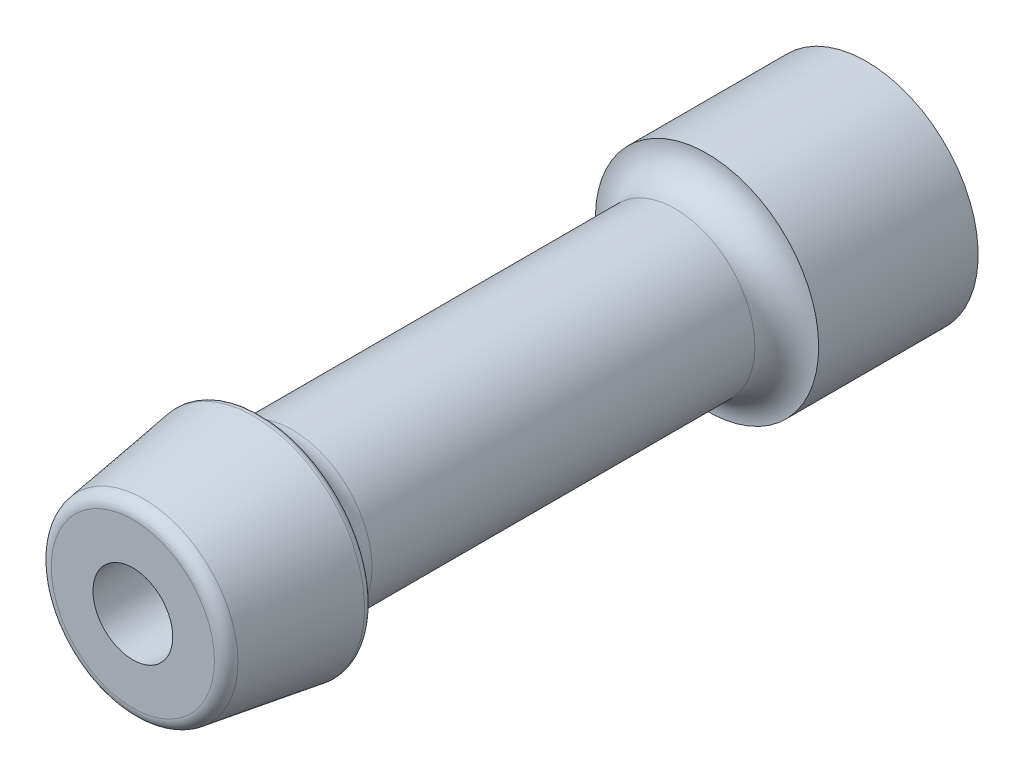
ISO-10303-21;
HEADER;
FILE_DESCRIPTION(('STEP AP214'),'2;1');
FILE_NAME('part.step','',(''),(''),'','','');
FILE_SCHEMA(('AUTOMOTIVE_DESIGN { 1 0 10303 214 1 1 1 1 }'));
ENDSEC;
DATA;
#1=APPLICATION_CONTEXT('core data for automotive mechanical design processes');
#2=APPLICATION_PROTOCOL_DEFINITION('international standard','automotive_design',2000,#1);
#3=PRODUCT_CONTEXT('',#1,'mechanical');
#4=PRODUCT('Part','Part','',(#3));
#5=PRODUCT_RELATED_PRODUCT_CATEGORY('part','',(#4));
#6=PRODUCT_DEFINITION_FORMATION('','',#4);
#7=PRODUCT_DEFINITION_CONTEXT('part definition',#1,'design');
#8=PRODUCT_DEFINITION('design','',#6,#7);
#9=PRODUCT_DEFINITION_SHAPE('','',#8);
#10=(LENGTH_UNIT() NAMED_UNIT(*) SI_UNIT(.MILLI.,.METRE.));
#11=(NAMED_UNIT(*) PLANE_ANGLE_UNIT() SI_UNIT($,.RADIAN.));
#12=(NAMED_UNIT(*) SI_UNIT($,.STERADIAN.) SOLID_ANGLE_UNIT());
#13=UNCERTAINTY_MEASURE_WITH_UNIT(LENGTH_MEASURE(1.E-05),#10,'distance_accuracy_value','');
#14=(GEOMETRIC_REPRESENTATION_CONTEXT(3) GLOBAL_UNCERTAINTY_ASSIGNED_CONTEXT((#13)) GLOBAL_UNIT_ASSIGNED_CONTEXT((#10,
#11,#12)) REPRESENTATION_CONTEXT('',''));
#15=CARTESIAN_POINT('',(0.,0.,0.));
#16=DIRECTION('',(0.,0.,1.));
#17=DIRECTION('',(1.,0.,0.));
#18=AXIS2_PLACEMENT_3D('',#15,#16,#17);
#19=CARTESIAN_POINT('',(0.,0.,29.21));
#20=DIRECTION('',(0.,0.,-1.));
#21=DIRECTION('',(-1.,0.,0.));
#22=AXIS2_PLACEMENT_3D('',#19,#20,#21);
#23=CYLINDRICAL_SURFACE('',#22,4.445);
#24=CARTESIAN_POINT('',(0.,0.,0.));
#25=DIRECTION('',(0.,0.,1.));
#26=DIRECTION('',(1.,0.,0.));
#27=AXIS2_PLACEMENT_3D('',#24,#25,#26);
#28=CIRCLE('',#27,4.445);
#29=CARTESIAN_POINT('',(-4.445,0.,0.));
#30=VERTEX_POINT('',#29);
#31=EDGE_CURVE('E62',#30,#30,#28,.T.);
#32=CARTESIAN_POINT('',(0.,0.,6.35));
#33=DIRECTION('',(0.,0.,1.));
#34=DIRECTION('',(1.,0.,0.));
#35=AXIS2_PLACEMENT_3D('',#32,#33,#34);
#36=CIRCLE('',#35,4.445);
#37=CARTESIAN_POINT('',(-4.445,0.,6.34999999999999));
#38=VERTEX_POINT('',#37);
#39=EDGE_CURVE('E63',#38,#38,#36,.T.);
#40=CARTESIAN_POINT('',(-4.445,0.,0.));
#41=CARTESIAN_POINT('',(-4.445,0.,0.066145833333333));
#42=CARTESIAN_POINT('',(-4.445,0.,0.132291666666666));
#43=CARTESIAN_POINT('',(-4.445,0.,0.264583333333332));
#44=CARTESIAN_POINT('',(-4.445,0.,0.330729166666665));
#45=CARTESIAN_POINT('',(-4.445,0.,0.463020833333332));
#46=CARTESIAN_POINT('',(-4.445,0.,0.529166666666666));
#47=CARTESIAN_POINT('',(-4.445,0.,0.661458333333333));
#48=CARTESIAN_POINT('',(-4.445,0.,0.727604166666666));
#49=CARTESIAN_POINT('',(-4.445,0.,0.859895833333332));
#50=CARTESIAN_POINT('',(-4.445,0.,0.926041666666665));
#51=CARTESIAN_POINT('',(-4.445,0.,1.05833333333333));
#52=CARTESIAN_POINT('',(-4.445,0.,1.12447916666667));
#53=CARTESIAN_POINT('',(-4.445,0.,1.25677083333333));
#54=CARTESIAN_POINT('',(-4.445,0.,1.32291666666667));
#55=CARTESIAN_POINT('',(-4.445,0.,1.45520833333333));
#56=CARTESIAN_POINT('',(-4.445,0.,1.52135416666667));
#57=CARTESIAN_POINT('',(-4.445,0.,1.65364583333333));
#58=CARTESIAN_POINT('',(-4.445,0.,1.71979166666666));
#59=CARTESIAN_POINT('',(-4.445,0.,1.85208333333333));
#60=CARTESIAN_POINT('',(-4.445,0.,1.91822916666666));
#61=CARTESIAN_POINT('',(-4.445,0.,2.05052083333333));
#62=CARTESIAN_POINT('',(-4.445,0.,2.11666666666666));
#63=CARTESIAN_POINT('',(-4.445,0.,2.24895833333333));
#64=CARTESIAN_POINT('',(-4.445,0.,2.31510416666667));
#65=CARTESIAN_POINT('',(-4.445,0.,2.44739583333333));
#66=CARTESIAN_POINT('',(-4.445,0.,2.51354166666666));
#67=CARTESIAN_POINT('',(-4.445,0.,2.64583333333333));
#68=CARTESIAN_POINT('',(-4.445,0.,2.71197916666667));
#69=CARTESIAN_POINT('',(-4.445,0.,2.84427083333333));
#70=CARTESIAN_POINT('',(-4.445,0.,2.91041666666667));
#71=CARTESIAN_POINT('',(-4.445,0.,3.04270833333333));
#72=CARTESIAN_POINT('',(-4.445,0.,3.10885416666666));
#73=CARTESIAN_POINT('',(-4.445,0.,3.24114583333333));
#74=CARTESIAN_POINT('',(-4.445,0.,3.30729166666666));
#75=CARTESIAN_POINT('',(-4.445,0.,3.43958333333333));
#76=CARTESIAN_POINT('',(-4.445,0.,3.50572916666666));
#77=CARTESIAN_POINT('',(-4.445,0.,3.63802083333333));
#78=CARTESIAN_POINT('',(-4.445,0.,3.70416666666666));
#79=CARTESIAN_POINT('',(-4.445,0.,3.83645833333333));
#80=CARTESIAN_POINT('',(-4.445,0.,3.90260416666666));
#81=CARTESIAN_POINT('',(-4.445,0.,4.03489583333333));
#82=CARTESIAN_POINT('',(-4.445,0.,4.10104166666666));
#83=CARTESIAN_POINT('',(-4.445,0.,4.23333333333333));
#84=CARTESIAN_POINT('',(-4.445,0.,4.29947916666666));
#85=CARTESIAN_POINT('',(-4.445,0.,4.43177083333333));
#86=CARTESIAN_POINT('',(-4.445,0.,4.49791666666666));
#87=CARTESIAN_POINT('',(-4.445,0.,4.63020833333333));
#88=CARTESIAN_POINT('',(-4.445,0.,4.69635416666666));
#89=CARTESIAN_POINT('',(-4.445,0.,4.82864583333333));
#90=CARTESIAN_POINT('',(-4.445,0.,4.89479166666666));
#91=CARTESIAN_POINT('',(-4.445,0.,5.02708333333333));
#92=CARTESIAN_POINT('',(-4.445,0.,5.09322916666666));
#93=CARTESIAN_POINT('',(-4.445,0.,5.22552083333333));
#94=CARTESIAN_POINT('',(-4.445,0.,5.29166666666666));
#95=CARTESIAN_POINT('',(-4.445,0.,5.42395833333333));
#96=CARTESIAN_POINT('',(-4.445,0.,5.49010416666666));
#97=CARTESIAN_POINT('',(-4.445,0.,5.62239583333333));
#98=CARTESIAN_POINT('',(-4.445,0.,5.68854166666666));
#99=CARTESIAN_POINT('',(-4.445,0.,5.82083333333333));
#100=CARTESIAN_POINT('',(-4.445,0.,5.88697916666666));
#101=CARTESIAN_POINT('',(-4.445,0.,6.01927083333333));
#102=CARTESIAN_POINT('',(-4.445,0.,6.08541666666666));
#103=CARTESIAN_POINT('',(-4.445,0.,6.21770833333333));
#104=CARTESIAN_POINT('',(-4.445,0.,6.28385416666666));
#105=CARTESIAN_POINT('',(-4.445,0.,6.34999999999999));
#106=B_SPLINE_CURVE_WITH_KNOTS('',3,(#40,#41,#42,#43,#44,#45,#46,#47,#48,#49,#50,#51,#52,#53,
#54,#55,#56,#57,#58,#59,#60,#61,#62,#63,#64,#65,#66,#67,#68,#69,#70,#71,#72,#73,#74,#75,#76,#77,
#78,#79,#80,#81,#82,#83,#84,#85,#86,#87,#88,#89,#90,#91,#92,#93,#94,#95,#96,#97,#98,#99,#100,
#101,#102,#103,#104,#105),.UNSPECIFIED.,.F.,.F.,(4,2,2,2,2,2,2,2,2,2,2,2,2,2,2,2,2,2,2,2,2,2,2,
2,2,2,2,2,2,2,2,2,4),(0.,0.198437499999999,0.396874999999998,0.5953125,0.793749999999999,
0.992187499999998,1.190625,1.3890625,1.5875,1.7859375,1.984375,2.1828125,2.38125,2.5796875,
2.778125,2.9765625,3.175,3.3734375,3.571875,3.7703125,3.96875,4.1671875,4.365625,4.5640625,
4.7625,4.96093749999999,5.15937499999999,5.3578125,5.55625,5.75468749999999,5.953125,6.1515625,
6.34999999999999),.UNSPECIFIED.);
#107=EDGE_CURVE('BSEAM36',#30,#38,#106,.T.);
#108=ORIENTED_EDGE('',*,*,#31,.T.);
#109=ORIENTED_EDGE('',*,*,#39,.F.);
#110=ORIENTED_EDGE('',*,*,#107,.T.);
#111=ORIENTED_EDGE('',*,*,#107,.F.);
#112=EDGE_LOOP('',(#108,#110,#109,#111));
#113=FACE_BOUND('',#112,.T.);
#114=ADVANCED_FACE('F36',(#113),#23,.T.);
#115=CARTESIAN_POINT('',(0.,0.,29.21));
#116=DIRECTION('',(0.,0.,1.));
#117=DIRECTION('',(1.,0.,0.));
#118=AXIS2_PLACEMENT_3D('',#115,#116,#117);
#119=PLANE('',#118);
#120=CARTESIAN_POINT('',(0.,0.,29.21));
#121=DIRECTION('',(0.,0.,1.));
#122=DIRECTION('',(1.,0.,0.));
#123=AXIS2_PLACEMENT_3D('',#120,#121,#122);
#124=CIRCLE('',#123,3.24806810887687);
#125=CARTESIAN_POINT('',(3.24806810887687,0.,29.21));
#126=VERTEX_POINT('',#125);
#127=EDGE_CURVE('E43',#126,#126,#124,.T.);
#128=ORIENTED_EDGE('',*,*,#127,.T.);
#129=EDGE_LOOP('',(#128));
#130=FACE_BOUND('',#129,.T.);
#131=CARTESIAN_POINT('',(0.,0.,29.21));
#132=DIRECTION('',(0.,0.,1.));
#133=DIRECTION('',(1.,0.,0.));
#134=AXIS2_PLACEMENT_3D('',#131,#132,#133);
#135=CIRCLE('',#134,1.5875);
#136=CARTESIAN_POINT('',(1.5875,0.,29.21));
#137=VERTEX_POINT('',#136);
#138=EDGE_CURVE('E66',#137,#137,#135,.T.);
#139=ORIENTED_EDGE('',*,*,#138,.F.);
#140=EDGE_LOOP('',(#139));
#141=FACE_BOUND('',#140,.T.);
#142=ADVANCED_FACE('F77',(#130,#141),#119,.T.);
#143=CARTESIAN_POINT('',(0.,0.,0.));
#144=DIRECTION('',(0.,0.,1.));
#145=DIRECTION('',(1.,0.,0.));
#146=AXIS2_PLACEMENT_3D('',#143,#144,#145);
#147=PLANE('',#146);
#148=CARTESIAN_POINT('',(0.,0.,0.));
#149=DIRECTION('',(0.,0.,1.));
#150=DIRECTION('',(1.,0.,0.));
#151=AXIS2_PLACEMENT_3D('',#148,#149,#150);
#152=CIRCLE('',#151,1.5875);
#153=CARTESIAN_POINT('',(1.5875,0.,0.));
#154=VERTEX_POINT('',#153);
#155=EDGE_CURVE('E69',#154,#154,#152,.T.);
#156=ORIENTED_EDGE('',*,*,#155,.T.);
#157=EDGE_LOOP('',(#156));
#158=FACE_BOUND('',#157,.T.);
#159=ORIENTED_EDGE('',*,*,#31,.F.);
#160=EDGE_LOOP('',(#159));
#161=FACE_BOUND('',#160,.T.);
#162=ADVANCED_FACE('F79',(#158,#161),#147,.F.);
#163=CARTESIAN_POINT('',(0.,0.,30.21));
#164=DIRECTION('',(0.,0.,-1.));
#165=DIRECTION('',(-1.,0.,0.));
#166=AXIS2_PLACEMENT_3D('',#163,#164,#165);
#167=CYLINDRICAL_SURFACE('',#166,1.5875);
#168=ORIENTED_EDGE('',*,*,#155,.F.);
#169=EDGE_LOOP('',(#168));
#170=FACE_BOUND('',#169,.T.);
#171=ORIENTED_EDGE('',*,*,#138,.T.);
#172=EDGE_LOOP('',(#171));
#173=FACE_BOUND('',#172,.T.);
#174=ADVANCED_FACE('F75',(#170,#173),#167,.F.);
#175=CARTESIAN_POINT('',(0.,0.,6.35));
#176=DIRECTION('',(0.,0.,1.));
#177=DIRECTION('',(1.,0.,0.));
#178=AXIS2_PLACEMENT_3D('',#175,#176,#177);
#179=CYLINDRICAL_SURFACE('',#178,3.175);
#180=CARTESIAN_POINT('',(0.,0.,22.86));
#181=DIRECTION('',(0.,0.,1.));
#182=DIRECTION('',(1.,0.,0.));
#183=AXIS2_PLACEMENT_3D('',#180,#181,#182);
#184=CIRCLE('',#183,3.175);
#185=CARTESIAN_POINT('',(3.175,0.,22.86));
#186=VERTEX_POINT('',#185);
#187=EDGE_CURVE('E56',#186,#186,#184,.F.);
#188=ORIENTED_EDGE('',*,*,#187,.T.);
#189=EDGE_LOOP('',(#188));
#190=FACE_BOUND('',#189,.T.);
#191=CARTESIAN_POINT('',(0.,0.,7.62));
#192=DIRECTION('',(0.,0.,1.));
#193=DIRECTION('',(1.,0.,0.));
#194=AXIS2_PLACEMENT_3D('',#191,#192,#193);
#195=CIRCLE('',#194,3.175);
#196=CARTESIAN_POINT('',(3.175,0.,7.62));
#197=VERTEX_POINT('',#196);
#198=EDGE_CURVE('E59',#197,#197,#195,.T.);
#199=ORIENTED_EDGE('',*,*,#198,.T.);
#200=EDGE_LOOP('',(#199));
#201=FACE_BOUND('',#200,.T.);
#202=ADVANCED_FACE('F96',(#190,#201),#179,.T.);
#203=CARTESIAN_POINT('',(0.,0.,7.62));
#204=DIRECTION('',(0.,0.,1.));
#205=DIRECTION('',(1.,0.,0.));
#206=AXIS2_PLACEMENT_3D('',#203,#204,#205);
#207=TOROIDAL_SURFACE('',#206,4.445,1.27);
#208=ORIENTED_EDGE('',*,*,#39,.T.);
#209=EDGE_LOOP('',(#208));
#210=FACE_BOUND('',#209,.T.);
#211=ORIENTED_EDGE('',*,*,#198,.F.);
#212=EDGE_LOOP('',(#211));
#213=FACE_BOUND('',#212,.T.);
#214=ADVANCED_FACE('F92',(#210,#213),#207,.F.);
#215=CARTESIAN_POINT('',(0.,0.,22.86));
#216=DIRECTION('',(0.,0.,1.));
#217=DIRECTION('',(1.,0.,0.));
#218=AXIS2_PLACEMENT_3D('',#215,#216,#217);
#219=TOROIDAL_SURFACE('',#218,4.445,1.27);
#220=CARTESIAN_POINT('',(0.,0.,24.1066973734676));
#221=DIRECTION('',(0.,0.,-1.));
#222=DIRECTION('',(-1.,0.,0.));
#223=AXIS2_PLACEMENT_3D('',#220,#221,#222);
#224=CIRCLE('',#223,4.20283134185255);
#225=CARTESIAN_POINT('',(-4.20283134185255,0.,24.1066973734676));
#226=VERTEX_POINT('',#225);
#227=EDGE_CURVE('E47',#226,#226,#224,.T.);
#228=ORIENTED_EDGE('',*,*,#227,.T.);
#229=EDGE_LOOP('',(#228));
#230=FACE_BOUND('',#229,.T.);
#231=ORIENTED_EDGE('',*,*,#187,.F.);
#232=EDGE_LOOP('',(#231));
#233=FACE_BOUND('',#232,.T.);
#234=ADVANCED_FACE('F95',(#230,#233),#219,.F.);
#235=CARTESIAN_POINT('',(0.,0.,29.21));
#236=DIRECTION('',(0.,0.,-1.));
#237=DIRECTION('',(-1.,0.,0.));
#238=AXIS2_PLACEMENT_3D('',#235,#236,#237);
#239=CONICAL_SURFACE('',#238,3.68578891314646,0.148352986419515);
#240=CARTESIAN_POINT('',(0.,0.,28.7770871808538));
#241=DIRECTION('',(0.,0.,1.));
#242=DIRECTION('',(1.,0.,0.));
#243=AXIS2_PLACEMENT_3D('',#240,#241,#242);
#244=CIRCLE('',#243,3.75048816746473);
#245=CARTESIAN_POINT('',(3.75048816746473,0.,28.7770871808538));
#246=VERTEX_POINT('',#245);
#247=EDGE_CURVE('E10',#246,#246,#244,.F.);
#248=ORIENTED_EDGE('',*,*,#247,.T.);
#249=EDGE_LOOP('',(#248));
#250=FACE_BOUND('',#249,.T.);
#251=CARTESIAN_POINT('',(0.,0.,24.3935804385881));
#252=DIRECTION('',(0.,0.,-1.));
#253=DIRECTION('',(-1.,0.,0.));
#254=AXIS2_PLACEMENT_3D('',#251,#252,#253);
#255=CIRCLE('',#254,4.40560763951698);
#256=CARTESIAN_POINT('',(-4.40560763951698,0.,24.3935804385881));
#257=VERTEX_POINT('',#256);
#258=EDGE_CURVE('E51',#257,#257,#255,.F.);
#259=ORIENTED_EDGE('',*,*,#258,.T.);
#260=EDGE_LOOP('',(#259));
#261=FACE_BOUND('',#260,.T.);
#262=ADVANCED_FACE('F100',(#250,#261),#239,.T.);
#263=CARTESIAN_POINT('',(0.,0.,24.3560368481611));
#264=DIRECTION('',(0.,0.,-1.));
#265=DIRECTION('',(-1.,0.,0.));
#266=AXIS2_PLACEMENT_3D('',#263,#264,#265);
#267=TOROIDAL_SURFACE('',#266,4.15439761022306,0.254);
#268=ORIENTED_EDGE('',*,*,#227,.F.);
#269=EDGE_LOOP('',(#268));
#270=FACE_BOUND('',#269,.T.);
#271=ORIENTED_EDGE('',*,*,#258,.F.);
#272=EDGE_LOOP('',(#271));
#273=FACE_BOUND('',#272,.T.);
#274=ADVANCED_FACE('F106',(#270,#273),#267,.T.);
#275=CARTESIAN_POINT('',(0.,0.,28.702));
#276=DIRECTION('',(0.,0.,1.));
#277=DIRECTION('',(1.,0.,0.));
#278=AXIS2_PLACEMENT_3D('',#275,#276,#277);
#279=TOROIDAL_SURFACE('',#278,3.24806810887687,0.508);
#280=ORIENTED_EDGE('',*,*,#247,.F.);
#281=EDGE_LOOP('',(#280));
#282=FACE_BOUND('',#281,.T.);
#283=ORIENTED_EDGE('',*,*,#127,.F.);
#284=EDGE_LOOP('',(#283));
#285=FACE_BOUND('',#284,.T.);
#286=ADVANCED_FACE('F38',(#282,#285),#279,.T.);
#287=CLOSED_SHELL('',(#114,#142,#162,#174,#202,#214,#234,#262,#274,#286));
#288=MANIFOLD_SOLID_BREP('B2',#287);
#289=ADVANCED_BREP_SHAPE_REPRESENTATION('',(#18,#288),#14);
#290=SHAPE_DEFINITION_REPRESENTATION(#9,#289);
ENDSEC;
END-ISO-10303-21;
